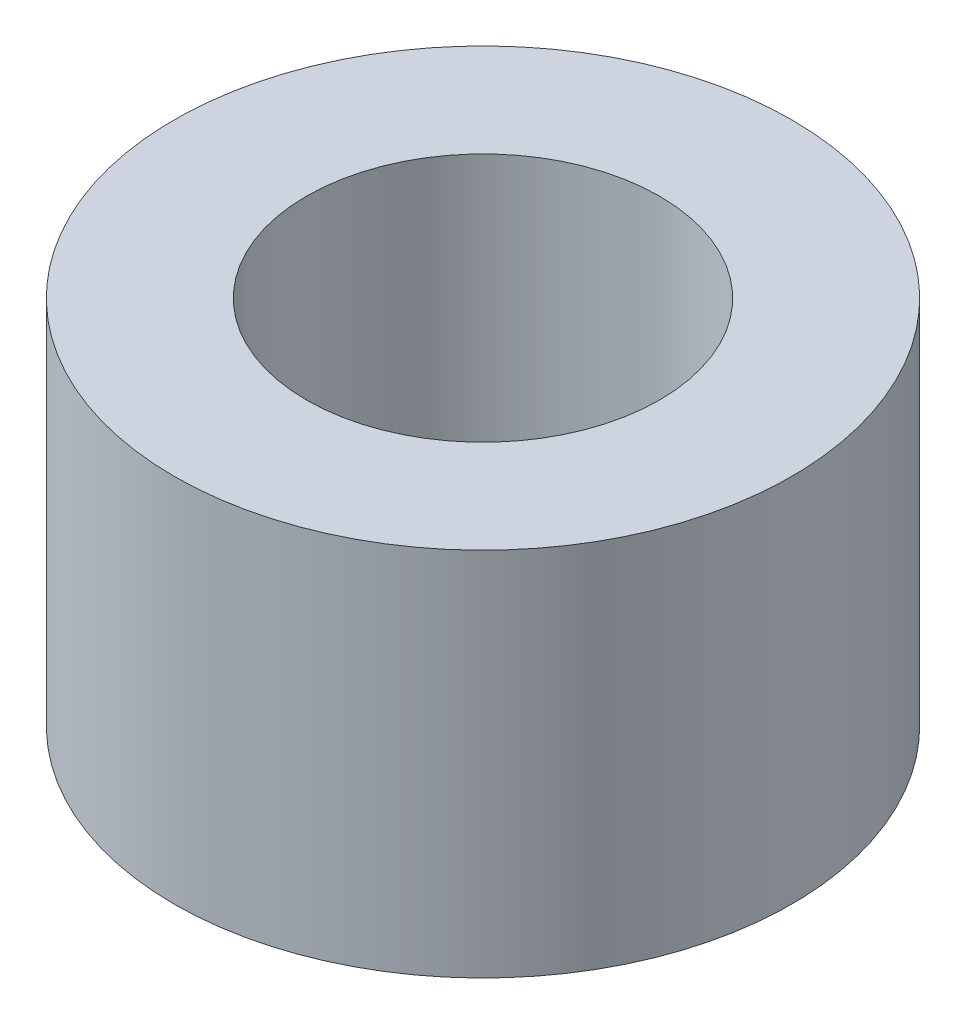
ISO-10303-21;
HEADER;
FILE_DESCRIPTION(('STEP AP214'),'2;1');
FILE_NAME('part.step','',(''),(''),'','','');
FILE_SCHEMA(('AUTOMOTIVE_DESIGN { 1 0 10303 214 1 1 1 1 }'));
ENDSEC;
DATA;
#1=APPLICATION_CONTEXT('core data for automotive mechanical design processes');
#2=APPLICATION_PROTOCOL_DEFINITION('international standard','automotive_design',2000,#1);
#3=PRODUCT_CONTEXT('',#1,'mechanical');
#4=PRODUCT('Part','Part','',(#3));
#5=PRODUCT_RELATED_PRODUCT_CATEGORY('part','',(#4));
#6=PRODUCT_DEFINITION_FORMATION('','',#4);
#7=PRODUCT_DEFINITION_CONTEXT('part definition',#1,'design');
#8=PRODUCT_DEFINITION('design','',#6,#7);
#9=PRODUCT_DEFINITION_SHAPE('','',#8);
#10=(LENGTH_UNIT() NAMED_UNIT(*) SI_UNIT(.MILLI.,.METRE.));
#11=(NAMED_UNIT(*) PLANE_ANGLE_UNIT() SI_UNIT($,.RADIAN.));
#12=(NAMED_UNIT(*) SI_UNIT($,.STERADIAN.) SOLID_ANGLE_UNIT());
#13=UNCERTAINTY_MEASURE_WITH_UNIT(LENGTH_MEASURE(1.E-05),#10,'distance_accuracy_value','');
#14=(GEOMETRIC_REPRESENTATION_CONTEXT(3) GLOBAL_UNCERTAINTY_ASSIGNED_CONTEXT((#13)) GLOBAL_UNIT_ASSIGNED_CONTEXT((#10,
#11,#12)) REPRESENTATION_CONTEXT('',''));
#15=CARTESIAN_POINT('',(0.,0.,0.));
#16=DIRECTION('',(0.,0.,1.));
#17=DIRECTION('',(1.,0.,0.));
#18=AXIS2_PLACEMENT_3D('',#15,#16,#17);
#19=CARTESIAN_POINT('',(0.,6.4,0.));
#20=DIRECTION('',(0.,1.,0.));
#21=DIRECTION('',(0.,0.,1.));
#22=AXIS2_PLACEMENT_3D('',#19,#20,#21);
#23=PLANE('',#22);
#24=CARTESIAN_POINT('',(0.,6.4,0.));
#25=DIRECTION('',(0.,1.,0.));
#26=DIRECTION('',(0.,0.,1.));
#27=AXIS2_PLACEMENT_3D('',#24,#25,#26);
#28=CIRCLE('',#27,5.334);
#29=CARTESIAN_POINT('',(0.,6.4,5.334));
#30=VERTEX_POINT('',#29);
#31=EDGE_CURVE('E10',#30,#30,#28,.T.);
#32=ORIENTED_EDGE('',*,*,#31,.T.);
#33=EDGE_LOOP('',(#32));
#34=FACE_BOUND('',#33,.T.);
#35=CARTESIAN_POINT('',(0.,6.4,0.));
#36=DIRECTION('',(0.,1.,0.));
#37=DIRECTION('',(0.,0.,1.));
#38=AXIS2_PLACEMENT_3D('',#35,#36,#37);
#39=CIRCLE('',#38,3.05);
#40=CARTESIAN_POINT('',(0.,6.4,3.05));
#41=VERTEX_POINT('',#40);
#42=EDGE_CURVE('E42',#41,#41,#39,.T.);
#43=ORIENTED_EDGE('',*,*,#42,.F.);
#44=EDGE_LOOP('',(#43));
#45=FACE_BOUND('',#44,.T.);
#46=ADVANCED_FACE('F31',(#34,#45),#23,.T.);
#47=CARTESIAN_POINT('',(0.,0.,0.));
#48=DIRECTION('',(0.,1.,0.));
#49=DIRECTION('',(0.,0.,1.));
#50=AXIS2_PLACEMENT_3D('',#47,#48,#49);
#51=PLANE('',#50);
#52=CARTESIAN_POINT('',(0.,0.,0.));
#53=DIRECTION('',(0.,1.,0.));
#54=DIRECTION('',(0.,0.,1.));
#55=AXIS2_PLACEMENT_3D('',#52,#53,#54);
#56=CIRCLE('',#55,5.334);
#57=CARTESIAN_POINT('',(0.,0.,5.334));
#58=VERTEX_POINT('',#57);
#59=EDGE_CURVE('E35',#58,#58,#56,.T.);
#60=ORIENTED_EDGE('',*,*,#59,.F.);
#61=EDGE_LOOP('',(#60));
#62=FACE_BOUND('',#61,.T.);
#63=CARTESIAN_POINT('',(0.,0.,0.));
#64=DIRECTION('',(0.,1.,0.));
#65=DIRECTION('',(0.,0.,1.));
#66=AXIS2_PLACEMENT_3D('',#63,#64,#65);
#67=CIRCLE('',#66,3.05);
#68=CARTESIAN_POINT('',(0.,0.,3.05));
#69=VERTEX_POINT('',#68);
#70=EDGE_CURVE('E44',#69,#69,#67,.T.);
#71=ORIENTED_EDGE('',*,*,#70,.T.);
#72=EDGE_LOOP('',(#71));
#73=FACE_BOUND('',#72,.T.);
#74=ADVANCED_FACE('F54',(#62,#73),#51,.F.);
#75=CARTESIAN_POINT('',(0.,6.4,0.));
#76=DIRECTION('',(0.,-1.,0.));
#77=DIRECTION('',(0.,0.,-1.));
#78=AXIS2_PLACEMENT_3D('',#75,#76,#77);
#79=CYLINDRICAL_SURFACE('',#78,5.334);
#80=ORIENTED_EDGE('',*,*,#31,.F.);
#81=EDGE_LOOP('',(#80));
#82=FACE_BOUND('',#81,.T.);
#83=ORIENTED_EDGE('',*,*,#59,.T.);
#84=EDGE_LOOP('',(#83));
#85=FACE_BOUND('',#84,.T.);
#86=ADVANCED_FACE('F33',(#82,#85),#79,.T.);
#87=CARTESIAN_POINT('',(0.,6.4,0.));
#88=DIRECTION('',(0.,-1.,0.));
#89=DIRECTION('',(0.,0.,-1.));
#90=AXIS2_PLACEMENT_3D('',#87,#88,#89);
#91=CYLINDRICAL_SURFACE('',#90,3.05);
#92=ORIENTED_EDGE('',*,*,#42,.T.);
#93=EDGE_LOOP('',(#92));
#94=FACE_BOUND('',#93,.T.);
#95=ORIENTED_EDGE('',*,*,#70,.F.);
#96=EDGE_LOOP('',(#95));
#97=FACE_BOUND('',#96,.T.);
#98=ADVANCED_FACE('F50',(#94,#97),#91,.F.);
#99=CLOSED_SHELL('',(#46,#74,#86,#98));
#100=MANIFOLD_SOLID_BREP('B2',#99);
#101=ADVANCED_BREP_SHAPE_REPRESENTATION('',(#18,#100),#14);
#102=SHAPE_DEFINITION_REPRESENTATION(#9,#101);
ENDSEC;
END-ISO-10303-21;
